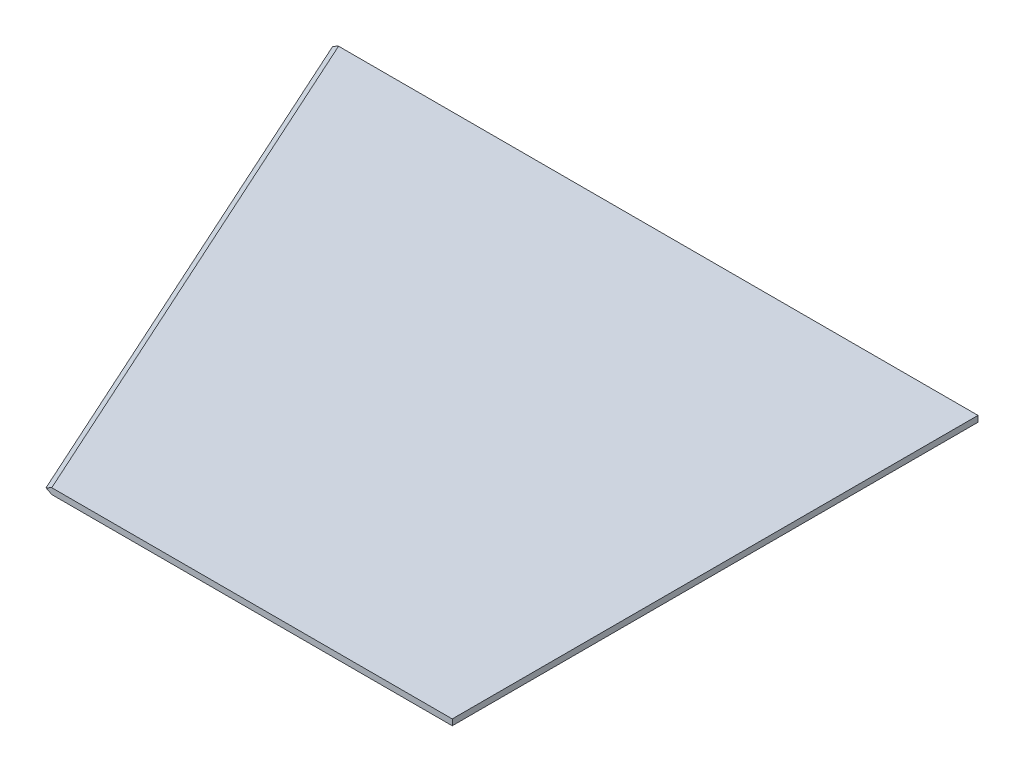
ISO-10303-21;
HEADER;
FILE_DESCRIPTION(('STEP AP214'),'2;1');
FILE_NAME('part.step','',(''),(''),'','','');
FILE_SCHEMA(('AUTOMOTIVE_DESIGN { 1 0 10303 214 1 1 1 1 }'));
ENDSEC;
DATA;
#1=APPLICATION_CONTEXT('core data for automotive mechanical design processes');
#2=APPLICATION_PROTOCOL_DEFINITION('international standard','automotive_design',2000,#1);
#3=PRODUCT_CONTEXT('',#1,'mechanical');
#4=PRODUCT('Part','Part','',(#3));
#5=PRODUCT_RELATED_PRODUCT_CATEGORY('part','',(#4));
#6=PRODUCT_DEFINITION_FORMATION('','',#4);
#7=PRODUCT_DEFINITION_CONTEXT('part definition',#1,'design');
#8=PRODUCT_DEFINITION('design','',#6,#7);
#9=PRODUCT_DEFINITION_SHAPE('','',#8);
#10=(LENGTH_UNIT() NAMED_UNIT(*) SI_UNIT(.MILLI.,.METRE.));
#11=(NAMED_UNIT(*) PLANE_ANGLE_UNIT() SI_UNIT($,.RADIAN.));
#12=(NAMED_UNIT(*) SI_UNIT($,.STERADIAN.) SOLID_ANGLE_UNIT());
#13=UNCERTAINTY_MEASURE_WITH_UNIT(LENGTH_MEASURE(1.E-05),#10,'distance_accuracy_value','');
#14=(GEOMETRIC_REPRESENTATION_CONTEXT(3) GLOBAL_UNCERTAINTY_ASSIGNED_CONTEXT((#13)) GLOBAL_UNIT_ASSIGNED_CONTEXT((#10,
#11,#12)) REPRESENTATION_CONTEXT('',''));
#15=CARTESIAN_POINT('',(0.,0.,0.));
#16=DIRECTION('',(0.,0.,1.));
#17=DIRECTION('',(1.,0.,0.));
#18=AXIS2_PLACEMENT_3D('',#15,#16,#17);
#19=CARTESIAN_POINT('',(216.,1.,176.));
#20=DIRECTION('',(0.,0.,-1.));
#21=DIRECTION('',(-1.,0.,0.));
#22=AXIS2_PLACEMENT_3D('',#19,#20,#21);
#23=PLANE('',#22);
#24=DIRECTION('',(1.,0.,0.));
#25=VECTOR('',#24,1.);
#26=CARTESIAN_POINT('',(216.,1.,176.));
#27=LINE('',#26,#25);
#28=CARTESIAN_POINT('',(81.9332873557751,1.,176.));
#29=VERTEX_POINT('',#28);
#30=CARTESIAN_POINT('',(216.,1.,176.));
#31=VERTEX_POINT('',#30);
#32=EDGE_CURVE('E87',#29,#31,#27,.T.);
#33=ORIENTED_EDGE('',*,*,#32,.F.);
#34=DIRECTION('',(0.888213184580753,0.459431538683313,0.));
#35=VECTOR('',#34,1.);
#36=CARTESIAN_POINT('',(18.5583076386832,-31.7809415024509,176.));
#37=LINE('',#36,#35);
#38=CARTESIAN_POINT('',(80.,0.,176.));
#39=VERTEX_POINT('',#38);
#40=EDGE_CURVE('E50',#29,#39,#37,.F.);
#41=ORIENTED_EDGE('',*,*,#40,.T.);
#42=DIRECTION('',(0.888213184580753,-0.459431538683313,0.));
#43=VECTOR('',#42,1.);
#44=CARTESIAN_POINT('',(80.,0.,176.));
#45=LINE('',#44,#43);
#46=CARTESIAN_POINT('',(81.9332873557751,-1.,176.));
#47=VERTEX_POINT('',#46);
#48=EDGE_CURVE('E128',#39,#47,#45,.T.);
#49=ORIENTED_EDGE('',*,*,#48,.T.);
#50=DIRECTION('',(1.,0.,0.));
#51=VECTOR('',#50,1.);
#52=CARTESIAN_POINT('',(216.,-1.,176.));
#53=LINE('',#52,#51);
#54=CARTESIAN_POINT('',(216.,-1.,176.));
#55=VERTEX_POINT('',#54);
#56=EDGE_CURVE('E101',#47,#55,#53,.T.);
#57=ORIENTED_EDGE('',*,*,#56,.T.);
#58=DIRECTION('',(0.,-1.,0.));
#59=VECTOR('',#58,1.);
#60=CARTESIAN_POINT('',(216.,1.,176.));
#61=LINE('',#60,#59);
#62=EDGE_CURVE('E99',#31,#55,#61,.T.);
#63=ORIENTED_EDGE('',*,*,#62,.F.);
#64=EDGE_LOOP('',(#33,#41,#49,#57,#63));
#65=FACE_BOUND('',#64,.T.);
#66=ADVANCED_FACE('F40',(#65),#23,.F.);
#67=CARTESIAN_POINT('',(216.,1.,0.));
#68=DIRECTION('',(-1.,0.,0.));
#69=DIRECTION('',(0.,0.,1.));
#70=AXIS2_PLACEMENT_3D('',#67,#68,#69);
#71=PLANE('',#70);
#72=DIRECTION('',(0.,0.,-1.));
#73=VECTOR('',#72,1.);
#74=CARTESIAN_POINT('',(216.,-1.,0.));
#75=LINE('',#74,#73);
#76=CARTESIAN_POINT('',(216.,-1.,0.));
#77=VERTEX_POINT('',#76);
#78=EDGE_CURVE('E118',#55,#77,#75,.T.);
#79=ORIENTED_EDGE('',*,*,#78,.T.);
#80=DIRECTION('',(0.,-1.,0.));
#81=VECTOR('',#80,1.);
#82=CARTESIAN_POINT('',(216.,1.,0.));
#83=LINE('',#82,#81);
#84=CARTESIAN_POINT('',(216.,1.,0.));
#85=VERTEX_POINT('',#84);
#86=EDGE_CURVE('E106',#85,#77,#83,.T.);
#87=ORIENTED_EDGE('',*,*,#86,.F.);
#88=DIRECTION('',(0.,0.,-1.));
#89=VECTOR('',#88,1.);
#90=CARTESIAN_POINT('',(216.,1.,0.));
#91=LINE('',#90,#89);
#92=EDGE_CURVE('E91',#31,#85,#91,.T.);
#93=ORIENTED_EDGE('',*,*,#92,.F.);
#94=ORIENTED_EDGE('',*,*,#62,.T.);
#95=EDGE_LOOP('',(#79,#87,#93,#94));
#96=FACE_BOUND('',#95,.T.);
#97=ADVANCED_FACE('F108',(#96),#71,.F.);
#98=CARTESIAN_POINT('',(0.,1.,0.));
#99=DIRECTION('',(0.,0.,1.));
#100=DIRECTION('',(1.,0.,0.));
#101=AXIS2_PLACEMENT_3D('',#98,#99,#100);
#102=PLANE('',#101);
#103=DIRECTION('',(-0.888213184580753,0.459431538683313,0.));
#104=VECTOR('',#103,1.);
#105=CARTESIAN_POINT('',(63.1138129010467,-32.6458520056593,0.));
#106=LINE('',#105,#104);
#107=CARTESIAN_POINT('',(1.93328735577511,-1.,0.));
#108=VERTEX_POINT('',#107);
#109=CARTESIAN_POINT('',(0.,0.,0.));
#110=VERTEX_POINT('',#109);
#111=EDGE_CURVE('E134',#108,#110,#106,.T.);
#112=ORIENTED_EDGE('',*,*,#111,.T.);
#113=DIRECTION('',(-0.888213184580753,-0.459431538683313,0.));
#114=VECTOR('',#113,1.);
#115=CARTESIAN_POINT('',(1.67212053972984,0.864910503208376,0.));
#116=LINE('',#115,#114);
#117=CARTESIAN_POINT('',(1.9332873557751,1.,0.));
#118=VERTEX_POINT('',#117);
#119=EDGE_CURVE('E11',#110,#118,#116,.F.);
#120=ORIENTED_EDGE('',*,*,#119,.T.);
#121=DIRECTION('',(-1.,0.,0.));
#122=VECTOR('',#121,1.);
#123=CARTESIAN_POINT('',(0.,1.,0.));
#124=LINE('',#123,#122);
#125=EDGE_CURVE('E111',#85,#118,#124,.T.);
#126=ORIENTED_EDGE('',*,*,#125,.F.);
#127=ORIENTED_EDGE('',*,*,#86,.T.);
#128=DIRECTION('',(-1.,0.,0.));
#129=VECTOR('',#128,1.);
#130=CARTESIAN_POINT('',(0.,-1.,0.));
#131=LINE('',#130,#129);
#132=EDGE_CURVE('E96',#77,#108,#131,.T.);
#133=ORIENTED_EDGE('',*,*,#132,.T.);
#134=EDGE_LOOP('',(#112,#120,#126,#127,#133));
#135=FACE_BOUND('',#134,.T.);
#136=ADVANCED_FACE('F155',(#135),#102,.F.);
#137=CARTESIAN_POINT('',(0.,1.,0.));
#138=DIRECTION('',(0.,-1.,0.));
#139=DIRECTION('',(0.,0.,-1.));
#140=AXIS2_PLACEMENT_3D('',#137,#138,#139);
#141=PLANE('',#140);
#142=ORIENTED_EDGE('',*,*,#125,.T.);
#143=DIRECTION('',(0.413802944301184,0.,0.910366477462605));
#144=VECTOR('',#143,1.);
#145=CARTESIAN_POINT('',(1.60224500033416,1.,-0.728293181970071));
#146=LINE('',#145,#144);
#147=EDGE_CURVE('E93',#118,#29,#146,.T.);
#148=ORIENTED_EDGE('',*,*,#147,.T.);
#149=ORIENTED_EDGE('',*,*,#32,.T.);
#150=ORIENTED_EDGE('',*,*,#92,.T.);
#151=EDGE_LOOP('',(#142,#148,#149,#150));
#152=FACE_BOUND('',#151,.T.);
#153=ADVANCED_FACE('F89',(#152),#141,.F.);
#154=CARTESIAN_POINT('',(0.,-1.,0.));
#155=DIRECTION('',(0.,-1.,0.));
#156=DIRECTION('',(0.,0.,-1.));
#157=AXIS2_PLACEMENT_3D('',#154,#155,#156);
#158=PLANE('',#157);
#159=ORIENTED_EDGE('',*,*,#56,.F.);
#160=DIRECTION('',(-0.413802944301184,0.,-0.910366477462605));
#161=VECTOR('',#160,1.);
#162=CARTESIAN_POINT('',(1.60224500033417,-1.,-0.728293181970076));
#163=LINE('',#162,#161);
#164=EDGE_CURVE('E131',#47,#108,#163,.T.);
#165=ORIENTED_EDGE('',*,*,#164,.T.);
#166=ORIENTED_EDGE('',*,*,#132,.F.);
#167=ORIENTED_EDGE('',*,*,#78,.F.);
#168=EDGE_LOOP('',(#159,#165,#166,#167));
#169=FACE_BOUND('',#168,.T.);
#170=ADVANCED_FACE('F149',(#169),#158,.T.);
#171=CARTESIAN_POINT('',(80.,0.,176.));
#172=DIRECTION('',(-0.449729604238877,-0.869456557392766,0.204422547381308));
#173=DIRECTION('',(-0.413802944301184,0.,-0.910366477462605));
#174=AXIS2_PLACEMENT_3D('',#171,#172,#173);
#175=PLANE('',#174);
#176=ORIENTED_EDGE('',*,*,#111,.F.);
#177=ORIENTED_EDGE('',*,*,#164,.F.);
#178=ORIENTED_EDGE('',*,*,#48,.F.);
#179=DIRECTION('',(0.413802944301184,0.,0.910366477462605));
#180=VECTOR('',#179,1.);
#181=CARTESIAN_POINT('',(80.,0.,176.));
#182=LINE('',#181,#180);
#183=EDGE_CURVE('E105',#110,#39,#182,.T.);
#184=ORIENTED_EDGE('',*,*,#183,.F.);
#185=EDGE_LOOP('',(#176,#177,#178,#184));
#186=FACE_BOUND('',#185,.T.);
#187=ADVANCED_FACE('F144',(#186),#175,.T.);
#188=CARTESIAN_POINT('',(1.60224500033417,1.,-0.728293181970077));
#189=DIRECTION('',(0.449729604238877,-0.869456557392766,-0.204422547381308));
#190=DIRECTION('',(0.413802944301184,0.,0.910366477462605));
#191=AXIS2_PLACEMENT_3D('',#188,#189,#190);
#192=PLANE('',#191);
#193=ORIENTED_EDGE('',*,*,#119,.F.);
#194=ORIENTED_EDGE('',*,*,#183,.T.);
#195=ORIENTED_EDGE('',*,*,#40,.F.);
#196=ORIENTED_EDGE('',*,*,#147,.F.);
#197=EDGE_LOOP('',(#193,#194,#195,#196));
#198=FACE_BOUND('',#197,.T.);
#199=ADVANCED_FACE('F43',(#198),#192,.F.);
#200=CLOSED_SHELL('',(#66,#97,#136,#153,#170,#187,#199));
#201=MANIFOLD_SOLID_BREP('B2',#200);
#202=ADVANCED_BREP_SHAPE_REPRESENTATION('',(#18,#201),#14);
#203=SHAPE_DEFINITION_REPRESENTATION(#9,#202);
ENDSEC;
END-ISO-10303-21;
